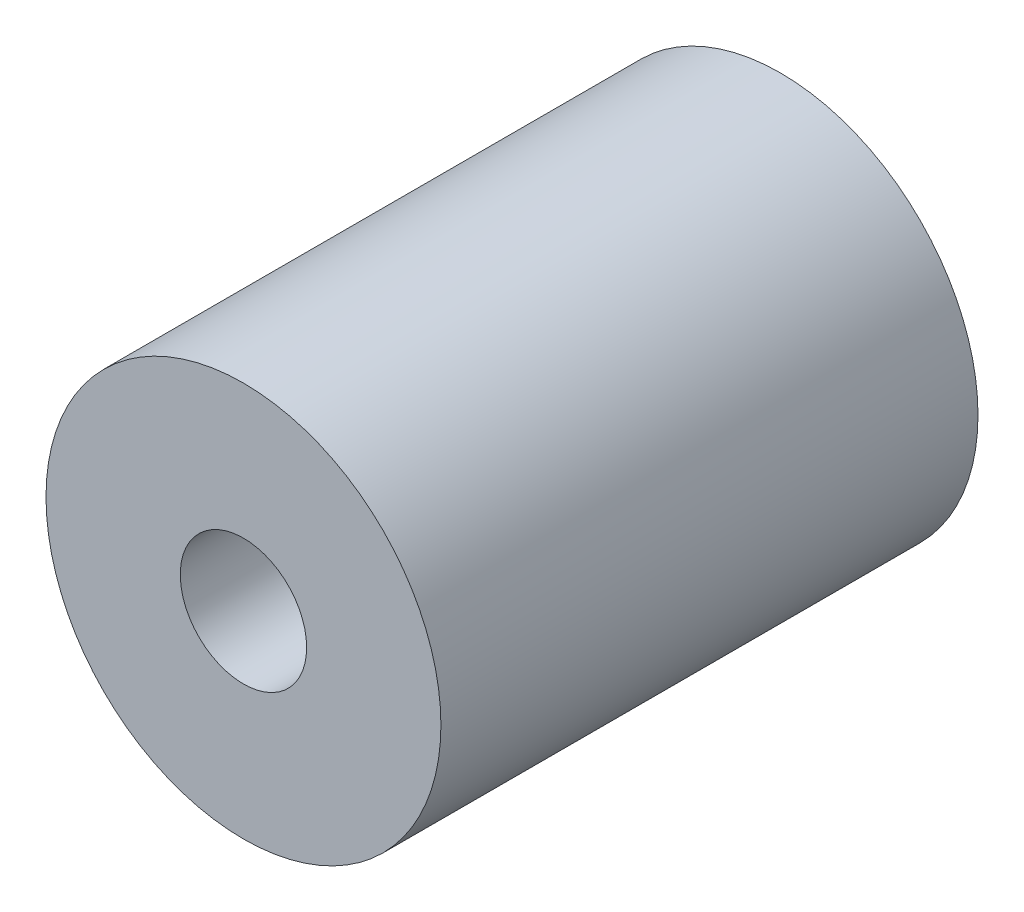
ISO-10303-21;
HEADER;
FILE_DESCRIPTION(('STEP AP214'),'2;1');
FILE_NAME('part.step','',(''),(''),'','','');
FILE_SCHEMA(('AUTOMOTIVE_DESIGN { 1 0 10303 214 1 1 1 1 }'));
ENDSEC;
DATA;
#1=APPLICATION_CONTEXT('core data for automotive mechanical design processes');
#2=APPLICATION_PROTOCOL_DEFINITION('international standard','automotive_design',2000,#1);
#3=PRODUCT_CONTEXT('',#1,'mechanical');
#4=PRODUCT('Part','Part','',(#3));
#5=PRODUCT_RELATED_PRODUCT_CATEGORY('part','',(#4));
#6=PRODUCT_DEFINITION_FORMATION('','',#4);
#7=PRODUCT_DEFINITION_CONTEXT('part definition',#1,'design');
#8=PRODUCT_DEFINITION('design','',#6,#7);
#9=PRODUCT_DEFINITION_SHAPE('','',#8);
#10=(LENGTH_UNIT() NAMED_UNIT(*) SI_UNIT(.MILLI.,.METRE.));
#11=(NAMED_UNIT(*) PLANE_ANGLE_UNIT() SI_UNIT($,.RADIAN.));
#12=(NAMED_UNIT(*) SI_UNIT($,.STERADIAN.) SOLID_ANGLE_UNIT());
#13=UNCERTAINTY_MEASURE_WITH_UNIT(LENGTH_MEASURE(1.E-05),#10,'distance_accuracy_value','');
#14=(GEOMETRIC_REPRESENTATION_CONTEXT(3) GLOBAL_UNCERTAINTY_ASSIGNED_CONTEXT((#13)) GLOBAL_UNIT_ASSIGNED_CONTEXT((#10,
#11,#12)) REPRESENTATION_CONTEXT('',''));
#15=CARTESIAN_POINT('',(0.,0.,0.));
#16=DIRECTION('',(0.,0.,1.));
#17=DIRECTION('',(1.,0.,0.));
#18=AXIS2_PLACEMENT_3D('',#15,#16,#17);
#19=CARTESIAN_POINT('',(0.,0.,34.));
#20=DIRECTION('',(0.,0.,-1.));
#21=DIRECTION('',(-1.,0.,0.));
#22=AXIS2_PLACEMENT_3D('',#19,#20,#21);
#23=CYLINDRICAL_SURFACE('',#22,12.5);
#24=CARTESIAN_POINT('',(0.,0.,34.));
#25=DIRECTION('',(0.,0.,1.));
#26=DIRECTION('',(1.,0.,0.));
#27=AXIS2_PLACEMENT_3D('',#24,#25,#26);
#28=CIRCLE('',#27,12.5);
#29=CARTESIAN_POINT('',(12.5,0.,34.));
#30=VERTEX_POINT('',#29);
#31=EDGE_CURVE('E10',#30,#30,#28,.T.);
#32=ORIENTED_EDGE('',*,*,#31,.F.);
#33=EDGE_LOOP('',(#32));
#34=FACE_BOUND('',#33,.T.);
#35=CARTESIAN_POINT('',(0.,0.,0.));
#36=DIRECTION('',(0.,0.,1.));
#37=DIRECTION('',(1.,0.,0.));
#38=AXIS2_PLACEMENT_3D('',#35,#36,#37);
#39=CIRCLE('',#38,12.5);
#40=CARTESIAN_POINT('',(12.5,0.,0.));
#41=VERTEX_POINT('',#40);
#42=EDGE_CURVE('E33',#41,#41,#39,.T.);
#43=ORIENTED_EDGE('',*,*,#42,.T.);
#44=EDGE_LOOP('',(#43));
#45=FACE_BOUND('',#44,.T.);
#46=ADVANCED_FACE('F30',(#34,#45),#23,.T.);
#47=CARTESIAN_POINT('',(0.,0.,34.));
#48=DIRECTION('',(0.,0.,1.));
#49=DIRECTION('',(1.,0.,0.));
#50=AXIS2_PLACEMENT_3D('',#47,#48,#49);
#51=PLANE('',#50);
#52=CARTESIAN_POINT('',(0.,0.,34.));
#53=DIRECTION('',(0.,0.,1.));
#54=DIRECTION('',(1.,0.,0.));
#55=AXIS2_PLACEMENT_3D('',#52,#53,#54);
#56=CIRCLE('',#55,4.);
#57=CARTESIAN_POINT('',(4.,0.,34.));
#58=VERTEX_POINT('',#57);
#59=EDGE_CURVE('E42',#58,#58,#56,.T.);
#60=ORIENTED_EDGE('',*,*,#59,.F.);
#61=EDGE_LOOP('',(#60));
#62=FACE_BOUND('',#61,.T.);
#63=ORIENTED_EDGE('',*,*,#31,.T.);
#64=EDGE_LOOP('',(#63));
#65=FACE_BOUND('',#64,.T.);
#66=ADVANCED_FACE('F67',(#62,#65),#51,.T.);
#67=CARTESIAN_POINT('',(0.,0.,0.));
#68=DIRECTION('',(0.,0.,1.));
#69=DIRECTION('',(1.,0.,0.));
#70=AXIS2_PLACEMENT_3D('',#67,#68,#69);
#71=PLANE('',#70);
#72=CARTESIAN_POINT('',(0.,0.,0.));
#73=DIRECTION('',(0.,0.,-1.));
#74=DIRECTION('',(-1.,0.,0.));
#75=AXIS2_PLACEMENT_3D('',#72,#73,#74);
#76=CIRCLE('',#75,6.);
#77=CARTESIAN_POINT('',(-6.,0.,0.));
#78=VERTEX_POINT('',#77);
#79=EDGE_CURVE('E48',#78,#78,#76,.T.);
#80=ORIENTED_EDGE('',*,*,#79,.F.);
#81=EDGE_LOOP('',(#80));
#82=FACE_BOUND('',#81,.T.);
#83=ORIENTED_EDGE('',*,*,#42,.F.);
#84=EDGE_LOOP('',(#83));
#85=FACE_BOUND('',#84,.T.);
#86=ADVANCED_FACE('F63',(#82,#85),#71,.F.);
#87=CARTESIAN_POINT('',(0.,0.,22.));
#88=DIRECTION('',(0.,0.,1.));
#89=DIRECTION('',(1.,0.,0.));
#90=AXIS2_PLACEMENT_3D('',#87,#88,#89);
#91=CYLINDRICAL_SURFACE('',#90,4.);
#92=CARTESIAN_POINT('',(0.,0.,22.));
#93=DIRECTION('',(0.,0.,1.));
#94=DIRECTION('',(1.,0.,0.));
#95=AXIS2_PLACEMENT_3D('',#92,#93,#94);
#96=CIRCLE('',#95,4.);
#97=CARTESIAN_POINT('',(4.,0.,22.));
#98=VERTEX_POINT('',#97);
#99=EDGE_CURVE('E40',#98,#98,#96,.T.);
#100=ORIENTED_EDGE('',*,*,#99,.F.);
#101=EDGE_LOOP('',(#100));
#102=FACE_BOUND('',#101,.T.);
#103=ORIENTED_EDGE('',*,*,#59,.T.);
#104=EDGE_LOOP('',(#103));
#105=FACE_BOUND('',#104,.T.);
#106=ADVANCED_FACE('F66',(#102,#105),#91,.F.);
#107=CARTESIAN_POINT('',(0.,0.,22.));
#108=DIRECTION('',(0.,0.,1.));
#109=DIRECTION('',(1.,0.,0.));
#110=AXIS2_PLACEMENT_3D('',#107,#108,#109);
#111=PLANE('',#110);
#112=ORIENTED_EDGE('',*,*,#99,.T.);
#113=EDGE_LOOP('',(#112));
#114=FACE_BOUND('',#113,.T.);
#115=ADVANCED_FACE('F59',(#114),#111,.T.);
#116=CARTESIAN_POINT('',(0.,0.,12.));
#117=DIRECTION('',(0.,0.,-1.));
#118=DIRECTION('',(-1.,0.,0.));
#119=AXIS2_PLACEMENT_3D('',#116,#117,#118);
#120=CYLINDRICAL_SURFACE('',#119,6.);
#121=CARTESIAN_POINT('',(0.,0.,12.));
#122=DIRECTION('',(0.,0.,-1.));
#123=DIRECTION('',(-1.,0.,0.));
#124=AXIS2_PLACEMENT_3D('',#121,#122,#123);
#125=CIRCLE('',#124,6.);
#126=CARTESIAN_POINT('',(-6.,0.,12.));
#127=VERTEX_POINT('',#126);
#128=EDGE_CURVE('E45',#127,#127,#125,.T.);
#129=ORIENTED_EDGE('',*,*,#128,.F.);
#130=EDGE_LOOP('',(#129));
#131=FACE_BOUND('',#130,.T.);
#132=ORIENTED_EDGE('',*,*,#79,.T.);
#133=EDGE_LOOP('',(#132));
#134=FACE_BOUND('',#133,.T.);
#135=ADVANCED_FACE('F56',(#131,#134),#120,.F.);
#136=CARTESIAN_POINT('',(0.,0.,12.));
#137=DIRECTION('',(0.,0.,-1.));
#138=DIRECTION('',(-1.,0.,0.));
#139=AXIS2_PLACEMENT_3D('',#136,#137,#138);
#140=PLANE('',#139);
#141=ORIENTED_EDGE('',*,*,#128,.T.);
#142=EDGE_LOOP('',(#141));
#143=FACE_BOUND('',#142,.T.);
#144=ADVANCED_FACE('F54',(#143),#140,.T.);
#145=CLOSED_SHELL('',(#46,#66,#86,#106,#115,#135,#144));
#146=MANIFOLD_SOLID_BREP('B2',#145);
#147=ADVANCED_BREP_SHAPE_REPRESENTATION('',(#18,#146),#14);
#148=SHAPE_DEFINITION_REPRESENTATION(#9,#147);
ENDSEC;
END-ISO-10303-21;
